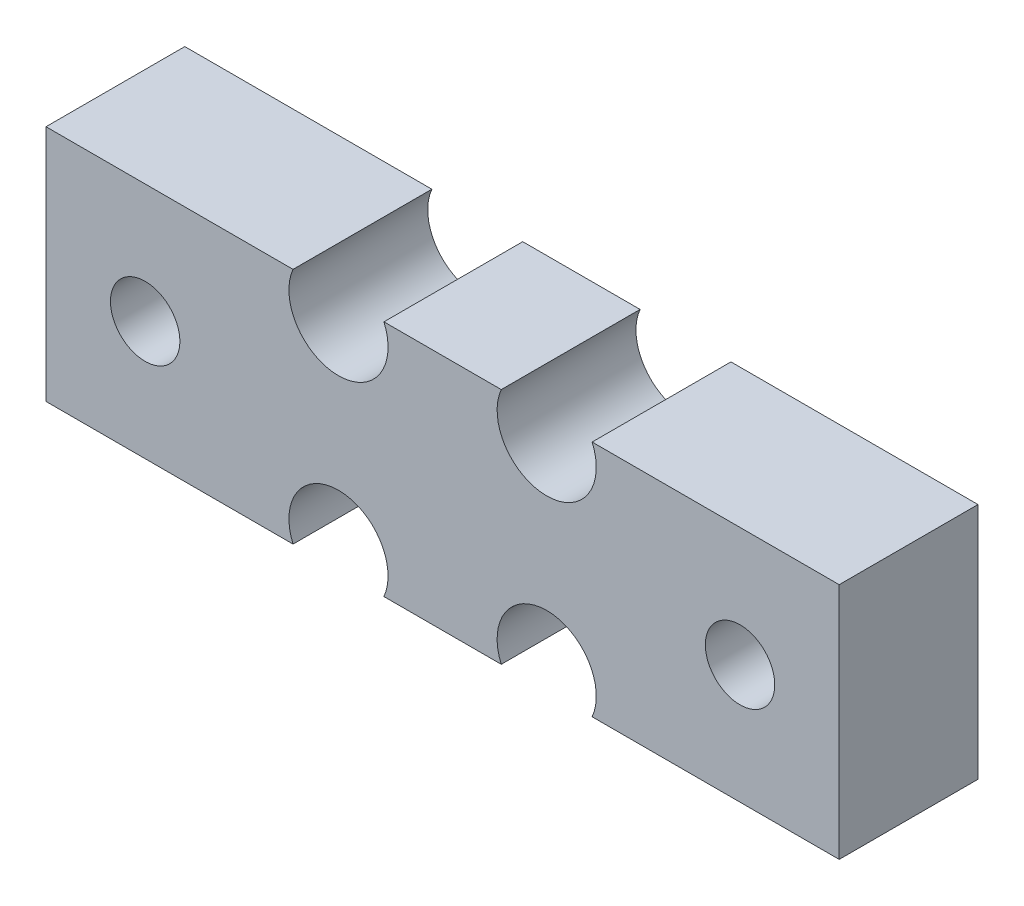
ISO-10303-21;
HEADER;
FILE_DESCRIPTION(('STEP AP214'),'2;1');
FILE_NAME('part.step','',(''),(''),'','','');
FILE_SCHEMA(('AUTOMOTIVE_DESIGN { 1 0 10303 214 1 1 1 1 }'));
ENDSEC;
DATA;
#1=APPLICATION_CONTEXT('core data for automotive mechanical design processes');
#2=APPLICATION_PROTOCOL_DEFINITION('international standard','automotive_design',2000,#1);
#3=PRODUCT_CONTEXT('',#1,'mechanical');
#4=PRODUCT('Part','Part','',(#3));
#5=PRODUCT_RELATED_PRODUCT_CATEGORY('part','',(#4));
#6=PRODUCT_DEFINITION_FORMATION('','',#4);
#7=PRODUCT_DEFINITION_CONTEXT('part definition',#1,'design');
#8=PRODUCT_DEFINITION('design','',#6,#7);
#9=PRODUCT_DEFINITION_SHAPE('','',#8);
#10=(LENGTH_UNIT() NAMED_UNIT(*) SI_UNIT(.MILLI.,.METRE.));
#11=(NAMED_UNIT(*) PLANE_ANGLE_UNIT() SI_UNIT($,.RADIAN.));
#12=(NAMED_UNIT(*) SI_UNIT($,.STERADIAN.) SOLID_ANGLE_UNIT());
#13=UNCERTAINTY_MEASURE_WITH_UNIT(LENGTH_MEASURE(1.E-05),#10,'distance_accuracy_value','');
#14=(GEOMETRIC_REPRESENTATION_CONTEXT(3) GLOBAL_UNCERTAINTY_ASSIGNED_CONTEXT((#13)) GLOBAL_UNIT_ASSIGNED_CONTEXT((#10,
#11,#12)) REPRESENTATION_CONTEXT('',''));
#15=CARTESIAN_POINT('',(0.,0.,0.));
#16=DIRECTION('',(0.,0.,1.));
#17=DIRECTION('',(1.,0.,0.));
#18=AXIS2_PLACEMENT_3D('',#15,#16,#17);
#19=CARTESIAN_POINT('',(-20.,6.,7.));
#20=DIRECTION('',(0.,-1.,0.));
#21=DIRECTION('',(0.,0.,-1.));
#22=AXIS2_PLACEMENT_3D('',#19,#20,#21);
#23=PLANE('',#22);
#24=DIRECTION('',(-1.,0.,0.));
#25=VECTOR('',#24,1.);
#26=CARTESIAN_POINT('',(-20.,6.,7.));
#27=LINE('',#26,#25);
#28=CARTESIAN_POINT('',(-7.54128784747792,6.,7.));
#29=VERTEX_POINT('',#28);
#30=CARTESIAN_POINT('',(-20.,6.,7.));
#31=VERTEX_POINT('',#30);
#32=EDGE_CURVE('E136',#29,#31,#27,.T.);
#33=ORIENTED_EDGE('',*,*,#32,.F.);
#34=DIRECTION('',(0.,0.,-1.));
#35=VECTOR('',#34,1.);
#36=CARTESIAN_POINT('',(-7.54128784747792,6.,7.));
#37=LINE('',#36,#35);
#38=CARTESIAN_POINT('',(-7.54128784747792,6.,0.));
#39=VERTEX_POINT('',#38);
#40=EDGE_CURVE('E120',#29,#39,#37,.T.);
#41=ORIENTED_EDGE('',*,*,#40,.T.);
#42=DIRECTION('',(-1.,0.,0.));
#43=VECTOR('',#42,1.);
#44=CARTESIAN_POINT('',(-20.,6.,0.));
#45=LINE('',#44,#43);
#46=CARTESIAN_POINT('',(-20.,6.,0.));
#47=VERTEX_POINT('',#46);
#48=EDGE_CURVE('E166',#39,#47,#45,.T.);
#49=ORIENTED_EDGE('',*,*,#48,.T.);
#50=DIRECTION('',(0.,0.,-1.));
#51=VECTOR('',#50,1.);
#52=CARTESIAN_POINT('',(-20.,6.,7.));
#53=LINE('',#52,#51);
#54=EDGE_CURVE('E144',#31,#47,#53,.T.);
#55=ORIENTED_EDGE('',*,*,#54,.F.);
#56=EDGE_LOOP('',(#33,#41,#49,#55));
#57=FACE_BOUND('',#56,.T.);
#58=ADVANCED_FACE('F33',(#57),#23,.F.);
#59=CARTESIAN_POINT('',(-20.,-6.,7.));
#60=DIRECTION('',(0.,1.,0.));
#61=DIRECTION('',(0.,0.,1.));
#62=AXIS2_PLACEMENT_3D('',#59,#60,#61);
#63=PLANE('',#62);
#64=DIRECTION('',(1.,0.,0.));
#65=VECTOR('',#64,1.);
#66=CARTESIAN_POINT('',(-20.,-6.,7.));
#67=LINE('',#66,#65);
#68=CARTESIAN_POINT('',(-2.95871215252208,-6.,7.));
#69=VERTEX_POINT('',#68);
#70=CARTESIAN_POINT('',(2.95871215252208,-6.,7.));
#71=VERTEX_POINT('',#70);
#72=EDGE_CURVE('E158',#69,#71,#67,.T.);
#73=ORIENTED_EDGE('',*,*,#72,.F.);
#74=DIRECTION('',(0.,0.,-1.));
#75=VECTOR('',#74,1.);
#76=CARTESIAN_POINT('',(-2.95871215252208,-6.,7.));
#77=LINE('',#76,#75);
#78=CARTESIAN_POINT('',(-2.95871215252208,-6.,0.));
#79=VERTEX_POINT('',#78);
#80=EDGE_CURVE('E202',#69,#79,#77,.T.);
#81=ORIENTED_EDGE('',*,*,#80,.T.);
#82=DIRECTION('',(1.,0.,0.));
#83=VECTOR('',#82,1.);
#84=CARTESIAN_POINT('',(-20.,-6.,0.));
#85=LINE('',#84,#83);
#86=CARTESIAN_POINT('',(2.95871215252208,-6.,0.));
#87=VERTEX_POINT('',#86);
#88=EDGE_CURVE('E177',#79,#87,#85,.T.);
#89=ORIENTED_EDGE('',*,*,#88,.T.);
#90=DIRECTION('',(0.,0.,-1.));
#91=VECTOR('',#90,1.);
#92=CARTESIAN_POINT('',(2.95871215252208,-6.,7.));
#93=LINE('',#92,#91);
#94=EDGE_CURVE('E48',#87,#71,#93,.F.);
#95=ORIENTED_EDGE('',*,*,#94,.T.);
#96=EDGE_LOOP('',(#73,#81,#89,#95));
#97=FACE_BOUND('',#96,.T.);
#98=ADVANCED_FACE('F200',(#97),#63,.F.);
#99=CARTESIAN_POINT('',(7.54128784747792,-6.,7.));
#100=VERTEX_POINT('',#99);
#101=CARTESIAN_POINT('',(20.,-6.,7.));
#102=VERTEX_POINT('',#101);
#103=EDGE_CURVE('E155',#100,#102,#67,.T.);
#104=ORIENTED_EDGE('',*,*,#103,.F.);
#105=DIRECTION('',(0.,0.,-1.));
#106=VECTOR('',#105,1.);
#107=CARTESIAN_POINT('',(7.54128784747792,-6.,7.));
#108=LINE('',#107,#106);
#109=CARTESIAN_POINT('',(7.54128784747792,-6.,0.));
#110=VERTEX_POINT('',#109);
#111=EDGE_CURVE('E208',#100,#110,#108,.T.);
#112=ORIENTED_EDGE('',*,*,#111,.T.);
#113=CARTESIAN_POINT('',(20.,-6.,0.));
#114=VERTEX_POINT('',#113);
#115=EDGE_CURVE('E174',#110,#114,#85,.T.);
#116=ORIENTED_EDGE('',*,*,#115,.T.);
#117=DIRECTION('',(0.,0.,-1.));
#118=VECTOR('',#117,1.);
#119=CARTESIAN_POINT('',(20.,-6.,7.));
#120=LINE('',#119,#118);
#121=EDGE_CURVE('E162',#102,#114,#120,.T.);
#122=ORIENTED_EDGE('',*,*,#121,.F.);
#123=EDGE_LOOP('',(#104,#112,#116,#122));
#124=FACE_BOUND('',#123,.T.);
#125=ADVANCED_FACE('F206',(#124),#63,.F.);
#126=CARTESIAN_POINT('',(2.95871215252208,6.,0.));
#127=VERTEX_POINT('',#126);
#128=CARTESIAN_POINT('',(-2.95871215252208,6.,0.));
#129=VERTEX_POINT('',#128);
#130=EDGE_CURVE('E172',#127,#129,#45,.T.);
#131=ORIENTED_EDGE('',*,*,#130,.T.);
#132=DIRECTION('',(0.,0.,-1.));
#133=VECTOR('',#132,1.);
#134=CARTESIAN_POINT('',(-2.95871215252208,6.,7.));
#135=LINE('',#134,#133);
#136=CARTESIAN_POINT('',(-2.95871215252208,6.,7.));
#137=VERTEX_POINT('',#136);
#138=EDGE_CURVE('E130',#129,#137,#135,.F.);
#139=ORIENTED_EDGE('',*,*,#138,.T.);
#140=CARTESIAN_POINT('',(2.95871215252208,6.,7.));
#141=VERTEX_POINT('',#140);
#142=EDGE_CURVE('E140',#141,#137,#27,.T.);
#143=ORIENTED_EDGE('',*,*,#142,.F.);
#144=DIRECTION('',(0.,0.,-1.));
#145=VECTOR('',#144,1.);
#146=CARTESIAN_POINT('',(2.95871215252208,6.,7.));
#147=LINE('',#146,#145);
#148=EDGE_CURVE('E167',#141,#127,#147,.T.);
#149=ORIENTED_EDGE('',*,*,#148,.T.);
#150=EDGE_LOOP('',(#131,#139,#143,#149));
#151=FACE_BOUND('',#150,.T.);
#152=ADVANCED_FACE('F234',(#151),#23,.F.);
#153=CARTESIAN_POINT('',(20.,6.,7.));
#154=DIRECTION('',(-1.,0.,0.));
#155=DIRECTION('',(0.,0.,1.));
#156=AXIS2_PLACEMENT_3D('',#153,#154,#155);
#157=PLANE('',#156);
#158=DIRECTION('',(0.,1.,0.));
#159=VECTOR('',#158,1.);
#160=CARTESIAN_POINT('',(20.,6.,0.));
#161=LINE('',#160,#159);
#162=CARTESIAN_POINT('',(20.,6.,0.));
#163=VERTEX_POINT('',#162);
#164=EDGE_CURVE('E163',#114,#163,#161,.T.);
#165=ORIENTED_EDGE('',*,*,#164,.T.);
#166=DIRECTION('',(0.,0.,-1.));
#167=VECTOR('',#166,1.);
#168=CARTESIAN_POINT('',(20.,6.,7.));
#169=LINE('',#168,#167);
#170=CARTESIAN_POINT('',(20.,6.,7.));
#171=VERTEX_POINT('',#170);
#172=EDGE_CURVE('E184',#171,#163,#169,.T.);
#173=ORIENTED_EDGE('',*,*,#172,.F.);
#174=DIRECTION('',(0.,1.,0.));
#175=VECTOR('',#174,1.);
#176=CARTESIAN_POINT('',(20.,6.,7.));
#177=LINE('',#176,#175);
#178=EDGE_CURVE('E146',#102,#171,#177,.T.);
#179=ORIENTED_EDGE('',*,*,#178,.F.);
#180=ORIENTED_EDGE('',*,*,#121,.T.);
#181=EDGE_LOOP('',(#165,#173,#179,#180));
#182=FACE_BOUND('',#181,.T.);
#183=ADVANCED_FACE('F35',(#182),#157,.F.);
#184=CARTESIAN_POINT('',(7.54128784747792,6.,0.));
#185=VERTEX_POINT('',#184);
#186=EDGE_CURVE('E168',#163,#185,#45,.T.);
#187=ORIENTED_EDGE('',*,*,#186,.T.);
#188=DIRECTION('',(0.,0.,-1.));
#189=VECTOR('',#188,1.);
#190=CARTESIAN_POINT('',(7.54128784747792,6.,7.));
#191=LINE('',#190,#189);
#192=CARTESIAN_POINT('',(7.54128784747792,6.,7.));
#193=VERTEX_POINT('',#192);
#194=EDGE_CURVE('E215',#185,#193,#191,.F.);
#195=ORIENTED_EDGE('',*,*,#194,.T.);
#196=EDGE_CURVE('E148',#171,#193,#27,.T.);
#197=ORIENTED_EDGE('',*,*,#196,.F.);
#198=ORIENTED_EDGE('',*,*,#172,.T.);
#199=EDGE_LOOP('',(#187,#195,#197,#198));
#200=FACE_BOUND('',#199,.T.);
#201=ADVANCED_FACE('F214',(#200),#23,.F.);
#202=CARTESIAN_POINT('',(-20.,6.,7.));
#203=DIRECTION('',(1.,0.,0.));
#204=DIRECTION('',(0.,0.,-1.));
#205=AXIS2_PLACEMENT_3D('',#202,#203,#204);
#206=PLANE('',#205);
#207=DIRECTION('',(0.,-1.,0.));
#208=VECTOR('',#207,1.);
#209=CARTESIAN_POINT('',(-20.,6.,0.));
#210=LINE('',#209,#208);
#211=CARTESIAN_POINT('',(-20.,-6.,0.));
#212=VERTEX_POINT('',#211);
#213=EDGE_CURVE('E171',#47,#212,#210,.T.);
#214=ORIENTED_EDGE('',*,*,#213,.T.);
#215=DIRECTION('',(0.,0.,-1.));
#216=VECTOR('',#215,1.);
#217=CARTESIAN_POINT('',(-20.,-6.,7.));
#218=LINE('',#217,#216);
#219=CARTESIAN_POINT('',(-20.,-6.,7.));
#220=VERTEX_POINT('',#219);
#221=EDGE_CURVE('E180',#220,#212,#218,.T.);
#222=ORIENTED_EDGE('',*,*,#221,.F.);
#223=DIRECTION('',(0.,-1.,0.));
#224=VECTOR('',#223,1.);
#225=CARTESIAN_POINT('',(-20.,6.,7.));
#226=LINE('',#225,#224);
#227=EDGE_CURVE('E154',#31,#220,#226,.T.);
#228=ORIENTED_EDGE('',*,*,#227,.F.);
#229=ORIENTED_EDGE('',*,*,#54,.T.);
#230=EDGE_LOOP('',(#214,#222,#228,#229));
#231=FACE_BOUND('',#230,.T.);
#232=ADVANCED_FACE('F238',(#231),#206,.F.);
#233=CARTESIAN_POINT('',(-7.54128784747792,-6.,0.));
#234=VERTEX_POINT('',#233);
#235=EDGE_CURVE('E150',#212,#234,#85,.T.);
#236=ORIENTED_EDGE('',*,*,#235,.T.);
#237=DIRECTION('',(0.,0.,-1.));
#238=VECTOR('',#237,1.);
#239=CARTESIAN_POINT('',(-7.54128784747792,-6.,7.));
#240=LINE('',#239,#238);
#241=CARTESIAN_POINT('',(-7.54128784747792,-6.,7.));
#242=VERTEX_POINT('',#241);
#243=EDGE_CURVE('E56',#234,#242,#240,.F.);
#244=ORIENTED_EDGE('',*,*,#243,.T.);
#245=EDGE_CURVE('E160',#220,#242,#67,.T.);
#246=ORIENTED_EDGE('',*,*,#245,.F.);
#247=ORIENTED_EDGE('',*,*,#221,.T.);
#248=EDGE_LOOP('',(#236,#244,#246,#247));
#249=FACE_BOUND('',#248,.T.);
#250=ADVANCED_FACE('F241',(#249),#63,.F.);
#251=CARTESIAN_POINT('',(0.,0.,7.));
#252=DIRECTION('',(0.,0.,1.));
#253=DIRECTION('',(1.,0.,0.));
#254=AXIS2_PLACEMENT_3D('',#251,#252,#253);
#255=PLANE('',#254);
#256=CARTESIAN_POINT('',(-15.,0.,7.));
#257=DIRECTION('',(0.,0.,-1.));
#258=DIRECTION('',(-1.,0.,0.));
#259=AXIS2_PLACEMENT_3D('',#256,#257,#258);
#260=CIRCLE('',#259,1.75);
#261=CARTESIAN_POINT('',(-16.75,0.,7.));
#262=VERTEX_POINT('',#261);
#263=EDGE_CURVE('E358',#262,#262,#260,.T.);
#264=ORIENTED_EDGE('',*,*,#263,.T.);
#265=EDGE_LOOP('',(#264));
#266=FACE_BOUND('',#265,.T.);
#267=CARTESIAN_POINT('',(15.,0.,7.));
#268=DIRECTION('',(0.,0.,-1.));
#269=DIRECTION('',(-1.,0.,0.));
#270=AXIS2_PLACEMENT_3D('',#267,#268,#269);
#271=CIRCLE('',#270,1.75);
#272=CARTESIAN_POINT('',(13.25,0.,7.));
#273=VERTEX_POINT('',#272);
#274=EDGE_CURVE('E219',#273,#273,#271,.T.);
#275=ORIENTED_EDGE('',*,*,#274,.T.);
#276=EDGE_LOOP('',(#275));
#277=FACE_BOUND('',#276,.T.);
#278=CARTESIAN_POINT('',(-5.25,-5.,7.));
#279=DIRECTION('',(0.,0.,-1.));
#280=DIRECTION('',(-1.,0.,0.));
#281=AXIS2_PLACEMENT_3D('',#278,#279,#280);
#282=CIRCLE('',#281,2.5);
#283=EDGE_CURVE('E217',#242,#69,#282,.T.);
#284=ORIENTED_EDGE('',*,*,#283,.T.);
#285=ORIENTED_EDGE('',*,*,#72,.T.);
#286=CARTESIAN_POINT('',(5.25,-5.,7.));
#287=DIRECTION('',(0.,0.,-1.));
#288=DIRECTION('',(-1.,0.,0.));
#289=AXIS2_PLACEMENT_3D('',#286,#287,#288);
#290=CIRCLE('',#289,2.5);
#291=EDGE_CURVE('E141',#71,#100,#290,.T.);
#292=ORIENTED_EDGE('',*,*,#291,.T.);
#293=ORIENTED_EDGE('',*,*,#103,.T.);
#294=ORIENTED_EDGE('',*,*,#178,.T.);
#295=ORIENTED_EDGE('',*,*,#196,.T.);
#296=CARTESIAN_POINT('',(5.25,5.,7.));
#297=DIRECTION('',(0.,0.,-1.));
#298=DIRECTION('',(-1.,0.,0.));
#299=AXIS2_PLACEMENT_3D('',#296,#297,#298);
#300=CIRCLE('',#299,2.5);
#301=EDGE_CURVE('E228',#193,#141,#300,.T.);
#302=ORIENTED_EDGE('',*,*,#301,.T.);
#303=ORIENTED_EDGE('',*,*,#142,.T.);
#304=CARTESIAN_POINT('',(-5.25,5.,7.));
#305=DIRECTION('',(0.,0.,-1.));
#306=DIRECTION('',(-1.,0.,0.));
#307=AXIS2_PLACEMENT_3D('',#304,#305,#306);
#308=CIRCLE('',#307,2.5);
#309=EDGE_CURVE('E123',#137,#29,#308,.T.);
#310=ORIENTED_EDGE('',*,*,#309,.T.);
#311=ORIENTED_EDGE('',*,*,#32,.T.);
#312=ORIENTED_EDGE('',*,*,#227,.T.);
#313=ORIENTED_EDGE('',*,*,#245,.T.);
#314=EDGE_LOOP('',(#284,#285,#292,#293,#294,#295,#302,#303,#310,#311,#312,#313));
#315=FACE_BOUND('',#314,.T.);
#316=ADVANCED_FACE('F135',(#266,#277,#315),#255,.T.);
#317=CARTESIAN_POINT('',(0.,0.,0.));
#318=DIRECTION('',(0.,0.,1.));
#319=DIRECTION('',(1.,0.,0.));
#320=AXIS2_PLACEMENT_3D('',#317,#318,#319);
#321=PLANE('',#320);
#322=CARTESIAN_POINT('',(-15.,0.,0.));
#323=DIRECTION('',(0.,0.,-1.));
#324=DIRECTION('',(-1.,0.,0.));
#325=AXIS2_PLACEMENT_3D('',#322,#323,#324);
#326=CIRCLE('',#325,1.75);
#327=CARTESIAN_POINT('',(-16.75,0.,0.));
#328=VERTEX_POINT('',#327);
#329=EDGE_CURVE('E361',#328,#328,#326,.T.);
#330=ORIENTED_EDGE('',*,*,#329,.F.);
#331=EDGE_LOOP('',(#330));
#332=FACE_BOUND('',#331,.T.);
#333=CARTESIAN_POINT('',(15.,0.,0.));
#334=DIRECTION('',(0.,0.,-1.));
#335=DIRECTION('',(-1.,0.,0.));
#336=AXIS2_PLACEMENT_3D('',#333,#334,#335);
#337=CIRCLE('',#336,1.75);
#338=CARTESIAN_POINT('',(13.25,0.,0.));
#339=VERTEX_POINT('',#338);
#340=EDGE_CURVE('E362',#339,#339,#337,.T.);
#341=ORIENTED_EDGE('',*,*,#340,.F.);
#342=EDGE_LOOP('',(#341));
#343=FACE_BOUND('',#342,.T.);
#344=ORIENTED_EDGE('',*,*,#88,.F.);
#345=CARTESIAN_POINT('',(-5.25,-5.,0.));
#346=DIRECTION('',(0.,0.,1.));
#347=DIRECTION('',(1.,0.,0.));
#348=AXIS2_PLACEMENT_3D('',#345,#346,#347);
#349=CIRCLE('',#348,2.5);
#350=EDGE_CURVE('E11',#79,#234,#349,.T.);
#351=ORIENTED_EDGE('',*,*,#350,.T.);
#352=ORIENTED_EDGE('',*,*,#235,.F.);
#353=ORIENTED_EDGE('',*,*,#213,.F.);
#354=ORIENTED_EDGE('',*,*,#48,.F.);
#355=CARTESIAN_POINT('',(-5.25,5.,0.));
#356=DIRECTION('',(0.,0.,1.));
#357=DIRECTION('',(1.,0.,0.));
#358=AXIS2_PLACEMENT_3D('',#355,#356,#357);
#359=CIRCLE('',#358,2.5);
#360=EDGE_CURVE('E126',#39,#129,#359,.T.);
#361=ORIENTED_EDGE('',*,*,#360,.T.);
#362=ORIENTED_EDGE('',*,*,#130,.F.);
#363=CARTESIAN_POINT('',(5.25,5.,0.));
#364=DIRECTION('',(0.,0.,1.));
#365=DIRECTION('',(1.,0.,0.));
#366=AXIS2_PLACEMENT_3D('',#363,#364,#365);
#367=CIRCLE('',#366,2.5);
#368=EDGE_CURVE('E187',#127,#185,#367,.T.);
#369=ORIENTED_EDGE('',*,*,#368,.T.);
#370=ORIENTED_EDGE('',*,*,#186,.F.);
#371=ORIENTED_EDGE('',*,*,#164,.F.);
#372=ORIENTED_EDGE('',*,*,#115,.F.);
#373=CARTESIAN_POINT('',(5.25,-5.,0.));
#374=DIRECTION('',(0.,0.,1.));
#375=DIRECTION('',(1.,0.,0.));
#376=AXIS2_PLACEMENT_3D('',#373,#374,#375);
#377=CIRCLE('',#376,2.5);
#378=EDGE_CURVE('E41',#110,#87,#377,.T.);
#379=ORIENTED_EDGE('',*,*,#378,.T.);
#380=EDGE_LOOP('',(#344,#351,#352,#353,#354,#361,#362,#369,#370,#371,#372,#379));
#381=FACE_BOUND('',#380,.T.);
#382=ADVANCED_FACE('F194',(#332,#343,#381),#321,.F.);
#383=CARTESIAN_POINT('',(5.25,5.,7.));
#384=DIRECTION('',(0.,0.,-1.));
#385=DIRECTION('',(-1.,0.,0.));
#386=AXIS2_PLACEMENT_3D('',#383,#384,#385);
#387=CYLINDRICAL_SURFACE('',#386,2.5);
#388=ORIENTED_EDGE('',*,*,#301,.F.);
#389=ORIENTED_EDGE('',*,*,#194,.F.);
#390=ORIENTED_EDGE('',*,*,#368,.F.);
#391=ORIENTED_EDGE('',*,*,#148,.F.);
#392=EDGE_LOOP('',(#388,#389,#390,#391));
#393=FACE_BOUND('',#392,.T.);
#394=ADVANCED_FACE('F315',(#393),#387,.F.);
#395=CARTESIAN_POINT('',(-5.25,5.,7.));
#396=DIRECTION('',(0.,0.,-1.));
#397=DIRECTION('',(-1.,0.,0.));
#398=AXIS2_PLACEMENT_3D('',#395,#396,#397);
#399=CYLINDRICAL_SURFACE('',#398,2.5);
#400=ORIENTED_EDGE('',*,*,#309,.F.);
#401=ORIENTED_EDGE('',*,*,#138,.F.);
#402=ORIENTED_EDGE('',*,*,#360,.F.);
#403=ORIENTED_EDGE('',*,*,#40,.F.);
#404=EDGE_LOOP('',(#400,#401,#402,#403));
#405=FACE_BOUND('',#404,.T.);
#406=ADVANCED_FACE('F122',(#405),#399,.F.);
#407=CARTESIAN_POINT('',(5.25,-5.,7.));
#408=DIRECTION('',(0.,0.,-1.));
#409=DIRECTION('',(-1.,0.,0.));
#410=AXIS2_PLACEMENT_3D('',#407,#408,#409);
#411=CYLINDRICAL_SURFACE('',#410,2.5);
#412=ORIENTED_EDGE('',*,*,#291,.F.);
#413=ORIENTED_EDGE('',*,*,#94,.F.);
#414=ORIENTED_EDGE('',*,*,#378,.F.);
#415=ORIENTED_EDGE('',*,*,#111,.F.);
#416=EDGE_LOOP('',(#412,#413,#414,#415));
#417=FACE_BOUND('',#416,.T.);
#418=ADVANCED_FACE('F246',(#417),#411,.F.);
#419=CARTESIAN_POINT('',(-5.25,-5.,7.));
#420=DIRECTION('',(0.,0.,-1.));
#421=DIRECTION('',(-1.,0.,0.));
#422=AXIS2_PLACEMENT_3D('',#419,#420,#421);
#423=CYLINDRICAL_SURFACE('',#422,2.5);
#424=ORIENTED_EDGE('',*,*,#283,.F.);
#425=ORIENTED_EDGE('',*,*,#243,.F.);
#426=ORIENTED_EDGE('',*,*,#350,.F.);
#427=ORIENTED_EDGE('',*,*,#80,.F.);
#428=EDGE_LOOP('',(#424,#425,#426,#427));
#429=FACE_BOUND('',#428,.T.);
#430=ADVANCED_FACE('F243',(#429),#423,.F.);
#431=CARTESIAN_POINT('',(15.,0.,7.));
#432=DIRECTION('',(0.,0.,-1.));
#433=DIRECTION('',(-1.,0.,0.));
#434=AXIS2_PLACEMENT_3D('',#431,#432,#433);
#435=CYLINDRICAL_SURFACE('',#434,1.75);
#436=ORIENTED_EDGE('',*,*,#274,.F.);
#437=EDGE_LOOP('',(#436));
#438=FACE_BOUND('',#437,.T.);
#439=ORIENTED_EDGE('',*,*,#340,.T.);
#440=EDGE_LOOP('',(#439));
#441=FACE_BOUND('',#440,.T.);
#442=ADVANCED_FACE('F245',(#438,#441),#435,.F.);
#443=CARTESIAN_POINT('',(-15.,0.,7.));
#444=DIRECTION('',(0.,0.,-1.));
#445=DIRECTION('',(-1.,0.,0.));
#446=AXIS2_PLACEMENT_3D('',#443,#444,#445);
#447=CYLINDRICAL_SURFACE('',#446,1.75);
#448=ORIENTED_EDGE('',*,*,#263,.F.);
#449=EDGE_LOOP('',(#448));
#450=FACE_BOUND('',#449,.T.);
#451=ORIENTED_EDGE('',*,*,#329,.T.);
#452=EDGE_LOOP('',(#451));
#453=FACE_BOUND('',#452,.T.);
#454=ADVANCED_FACE('F252',(#450,#453),#447,.F.);
#455=CLOSED_SHELL('',(#58,#98,#125,#152,#183,#201,#232,#250,#316,#382,#394,#406,#418,#430,#442,#454));
#456=MANIFOLD_SOLID_BREP('B2',#455);
#457=ADVANCED_BREP_SHAPE_REPRESENTATION('',(#18,#456),#14);
#458=SHAPE_DEFINITION_REPRESENTATION(#9,#457);
ENDSEC;
END-ISO-10303-21;
